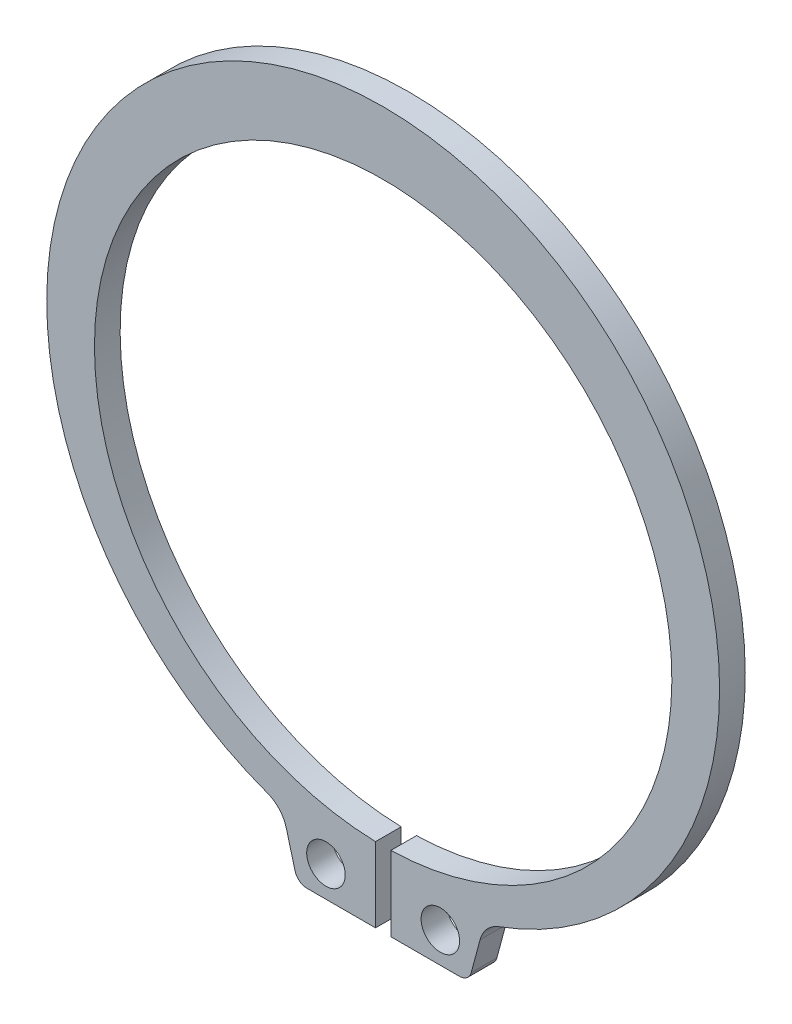
ISO-10303-21;
HEADER;
FILE_DESCRIPTION(('STEP AP214'),'2;1');
FILE_NAME('part.step','',(''),(''),'','','');
FILE_SCHEMA(('AUTOMOTIVE_DESIGN { 1 0 10303 214 1 1 1 1 }'));
ENDSEC;
DATA;
#1=APPLICATION_CONTEXT('core data for automotive mechanical design processes');
#2=APPLICATION_PROTOCOL_DEFINITION('international standard','automotive_design',2000,#1);
#3=PRODUCT_CONTEXT('',#1,'mechanical');
#4=PRODUCT('Part','Part','',(#3));
#5=PRODUCT_RELATED_PRODUCT_CATEGORY('part','',(#4));
#6=PRODUCT_DEFINITION_FORMATION('','',#4);
#7=PRODUCT_DEFINITION_CONTEXT('part definition',#1,'design');
#8=PRODUCT_DEFINITION('design','',#6,#7);
#9=PRODUCT_DEFINITION_SHAPE('','',#8);
#10=(LENGTH_UNIT() NAMED_UNIT(*) SI_UNIT(.MILLI.,.METRE.));
#11=(NAMED_UNIT(*) PLANE_ANGLE_UNIT() SI_UNIT($,.RADIAN.));
#12=(NAMED_UNIT(*) SI_UNIT($,.STERADIAN.) SOLID_ANGLE_UNIT());
#13=UNCERTAINTY_MEASURE_WITH_UNIT(LENGTH_MEASURE(1.E-05),#10,'distance_accuracy_value','');
#14=(GEOMETRIC_REPRESENTATION_CONTEXT(3) GLOBAL_UNCERTAINTY_ASSIGNED_CONTEXT((#13)) GLOBAL_UNIT_ASSIGNED_CONTEXT((#10,
#11,#12)) REPRESENTATION_CONTEXT('',''));
#15=CARTESIAN_POINT('',(0.,0.,0.));
#16=DIRECTION('',(0.,0.,1.));
#17=DIRECTION('',(1.,0.,0.));
#18=AXIS2_PLACEMENT_3D('',#15,#16,#17);
#19=CARTESIAN_POINT('',(0.,-15.7226,1.0668));
#20=DIRECTION('',(0.,1.,0.));
#21=DIRECTION('',(-1.,0.,0.));
#22=AXIS2_PLACEMENT_3D('',#19,#20,#21);
#23=PLANE('',#22);
#24=DIRECTION('',(1.,0.,0.));
#25=VECTOR('',#24,1.);
#26=CARTESIAN_POINT('',(0.,-15.7226,0.));
#27=LINE('',#26,#25);
#28=CARTESIAN_POINT('',(-3.16619789010669,-15.7226,0.));
#29=VERTEX_POINT('',#28);
#30=CARTESIAN_POINT('',(-0.3175,-15.7226,0.));
#31=VERTEX_POINT('',#30);
#32=EDGE_CURVE('E182',#29,#31,#27,.T.);
#33=ORIENTED_EDGE('',*,*,#32,.T.);
#34=DIRECTION('',(0.,0.,1.));
#35=VECTOR('',#34,1.);
#36=CARTESIAN_POINT('',(-0.3175,-15.7226,1.0668));
#37=LINE('',#36,#35);
#38=CARTESIAN_POINT('',(-0.3175,-15.7226,1.0668));
#39=VERTEX_POINT('',#38);
#40=EDGE_CURVE('E61',#31,#39,#37,.T.);
#41=ORIENTED_EDGE('',*,*,#40,.T.);
#42=DIRECTION('',(1.,0.,0.));
#43=VECTOR('',#42,1.);
#44=CARTESIAN_POINT('',(0.,-15.7226,1.0668));
#45=LINE('',#44,#43);
#46=CARTESIAN_POINT('',(-3.16619789010669,-15.7226,1.0668));
#47=VERTEX_POINT('',#46);
#48=EDGE_CURVE('E147',#47,#39,#45,.T.);
#49=ORIENTED_EDGE('',*,*,#48,.F.);
#50=DIRECTION('',(0.,0.,-1.));
#51=VECTOR('',#50,1.);
#52=CARTESIAN_POINT('',(-3.16619789010669,-15.7226,1.0668));
#53=LINE('',#52,#51);
#54=EDGE_CURVE('E181',#47,#29,#53,.T.);
#55=ORIENTED_EDGE('',*,*,#54,.T.);
#56=EDGE_LOOP('',(#33,#41,#49,#55));
#57=FACE_BOUND('',#56,.T.);
#58=ADVANCED_FACE('F38',(#57),#23,.F.);
#59=CARTESIAN_POINT('',(0.3175,-15.7226,1.0668));
#60=VERTEX_POINT('',#59);
#61=CARTESIAN_POINT('',(3.16619789010669,-15.7226,1.0668));
#62=VERTEX_POINT('',#61);
#63=EDGE_CURVE('E138',#60,#62,#45,.T.);
#64=ORIENTED_EDGE('',*,*,#63,.F.);
#65=DIRECTION('',(0.,0.,-1.));
#66=VECTOR('',#65,1.);
#67=CARTESIAN_POINT('',(0.3175,-15.7226,1.0668));
#68=LINE('',#67,#66);
#69=CARTESIAN_POINT('',(0.3175,-15.7226,0.));
#70=VERTEX_POINT('',#69);
#71=EDGE_CURVE('E124',#60,#70,#68,.T.);
#72=ORIENTED_EDGE('',*,*,#71,.T.);
#73=CARTESIAN_POINT('',(3.16619789010669,-15.7226,0.));
#74=VERTEX_POINT('',#73);
#75=EDGE_CURVE('E186',#70,#74,#27,.T.);
#76=ORIENTED_EDGE('',*,*,#75,.T.);
#77=DIRECTION('',(0.,0.,-1.));
#78=VECTOR('',#77,1.);
#79=CARTESIAN_POINT('',(3.16619789010669,-15.7226,1.0668));
#80=LINE('',#79,#78);
#81=EDGE_CURVE('E146',#62,#74,#80,.T.);
#82=ORIENTED_EDGE('',*,*,#81,.F.);
#83=EDGE_LOOP('',(#64,#72,#76,#82));
#84=FACE_BOUND('',#83,.T.);
#85=ADVANCED_FACE('F40',(#84),#23,.F.);
#86=CARTESIAN_POINT('',(3.16619789010669,-15.2146,1.0668));
#87=DIRECTION('',(0.,0.,-1.));
#88=DIRECTION('',(-1.,0.,0.));
#89=AXIS2_PLACEMENT_3D('',#86,#87,#88);
#90=CYLINDRICAL_SURFACE('',#89,0.508);
#91=CARTESIAN_POINT('',(3.16619789010669,-15.2146,0.));
#92=DIRECTION('',(0.,0.,1.));
#93=DIRECTION('',(1.,0.,0.));
#94=AXIS2_PLACEMENT_3D('',#91,#92,#93);
#95=CIRCLE('',#94,0.508);
#96=CARTESIAN_POINT('',(3.65688820986153,-15.3460800749121,0.));
#97=VERTEX_POINT('',#96);
#98=EDGE_CURVE('E185',#74,#97,#95,.T.);
#99=ORIENTED_EDGE('',*,*,#98,.T.);
#100=DIRECTION('',(0.,0.,-1.));
#101=VECTOR('',#100,1.);
#102=CARTESIAN_POINT('',(3.65688820986153,-15.3460800749121,1.0668));
#103=LINE('',#102,#101);
#104=CARTESIAN_POINT('',(3.65688820986153,-15.3460800749121,1.0668));
#105=VERTEX_POINT('',#104);
#106=EDGE_CURVE('E222',#105,#97,#103,.T.);
#107=ORIENTED_EDGE('',*,*,#106,.F.);
#108=CARTESIAN_POINT('',(3.16619789010669,-15.2146,1.0668));
#109=DIRECTION('',(0.,0.,1.));
#110=DIRECTION('',(1.,0.,0.));
#111=AXIS2_PLACEMENT_3D('',#108,#109,#110);
#112=CIRCLE('',#111,0.508);
#113=EDGE_CURVE('E151',#62,#105,#112,.T.);
#114=ORIENTED_EDGE('',*,*,#113,.F.);
#115=ORIENTED_EDGE('',*,*,#81,.T.);
#116=EDGE_LOOP('',(#99,#107,#114,#115));
#117=FACE_BOUND('',#116,.T.);
#118=ADVANCED_FACE('F268',(#117),#90,.T.);
#119=CARTESIAN_POINT('',(7.24844316792874,-1.9422144932294,1.0668));
#120=DIRECTION('',(-0.965925826289068,0.258819045102521,0.));
#121=DIRECTION('',(-0.258819045102521,-0.965925826289068,0.));
#122=AXIS2_PLACEMENT_3D('',#119,#120,#121);
#123=PLANE('',#122);
#124=DIRECTION('',(0.258819045102521,0.965925826289068,0.));
#125=VECTOR('',#124,1.);
#126=CARTESIAN_POINT('',(7.24844316792874,-1.9422144932294,0.));
#127=LINE('',#126,#125);
#128=CARTESIAN_POINT('',(4.02334540152789,-13.9784432168142,0.));
#129=VERTEX_POINT('',#128);
#130=EDGE_CURVE('E188',#97,#129,#127,.T.);
#131=ORIENTED_EDGE('',*,*,#130,.T.);
#132=DIRECTION('',(0.,0.,-1.));
#133=VECTOR('',#132,1.);
#134=CARTESIAN_POINT('',(4.02334540152789,-13.9784432168142,1.0668));
#135=LINE('',#134,#133);
#136=CARTESIAN_POINT('',(4.02334540152789,-13.9784432168142,1.0668));
#137=VERTEX_POINT('',#136);
#138=EDGE_CURVE('E219',#137,#129,#135,.T.);
#139=ORIENTED_EDGE('',*,*,#138,.F.);
#140=DIRECTION('',(0.258819045102521,0.965925826289068,0.));
#141=VECTOR('',#140,1.);
#142=CARTESIAN_POINT('',(7.24844316792874,-1.9422144932294,1.0668));
#143=LINE('',#142,#141);
#144=EDGE_CURVE('E159',#105,#137,#143,.T.);
#145=ORIENTED_EDGE('',*,*,#144,.F.);
#146=ORIENTED_EDGE('',*,*,#106,.T.);
#147=EDGE_LOOP('',(#131,#139,#145,#146));
#148=FACE_BOUND('',#147,.T.);
#149=ADVANCED_FACE('F265',(#148),#123,.F.);
#150=CARTESIAN_POINT('',(5.25007120091501,-14.3071434040944,1.0668));
#151=DIRECTION('',(0.,0.,-1.));
#152=DIRECTION('',(-1.,0.,0.));
#153=AXIS2_PLACEMENT_3D('',#150,#151,#152);
#154=CYLINDRICAL_SURFACE('',#153,1.27);
#155=CARTESIAN_POINT('',(5.25007120091501,-14.3071434040944,0.));
#156=DIRECTION('',(0.,0.,1.));
#157=DIRECTION('',(1.,0.,0.));
#158=AXIS2_PLACEMENT_3D('',#155,#156,#157);
#159=CIRCLE('',#158,1.27);
#160=CARTESIAN_POINT('',(4.81256526750542,-13.1148814537532,0.));
#161=VERTEX_POINT('',#160);
#162=EDGE_CURVE('E190',#129,#161,#159,.F.);
#163=ORIENTED_EDGE('',*,*,#162,.T.);
#164=DIRECTION('',(0.,0.,-1.));
#165=VECTOR('',#164,1.);
#166=CARTESIAN_POINT('',(4.81256526750542,-13.1148814537532,1.0668));
#167=LINE('',#166,#165);
#168=CARTESIAN_POINT('',(4.81256526750542,-13.1148814537532,1.0668));
#169=VERTEX_POINT('',#168);
#170=EDGE_CURVE('E216',#169,#161,#167,.T.);
#171=ORIENTED_EDGE('',*,*,#170,.F.);
#172=CARTESIAN_POINT('',(5.25007120091501,-14.3071434040944,1.0668));
#173=DIRECTION('',(0.,0.,1.));
#174=DIRECTION('',(1.,0.,0.));
#175=AXIS2_PLACEMENT_3D('',#172,#173,#174);
#176=CIRCLE('',#175,1.27);
#177=EDGE_CURVE('E161',#137,#169,#176,.F.);
#178=ORIENTED_EDGE('',*,*,#177,.F.);
#179=ORIENTED_EDGE('',*,*,#138,.T.);
#180=EDGE_LOOP('',(#163,#171,#178,#179));
#181=FACE_BOUND('',#180,.T.);
#182=ADVANCED_FACE('F260',(#181),#154,.F.);
#183=CARTESIAN_POINT('',(0.,0.,1.0668));
#184=DIRECTION('',(0.,0.,-1.));
#185=DIRECTION('',(-1.,0.,0.));
#186=AXIS2_PLACEMENT_3D('',#183,#184,#185);
#187=CYLINDRICAL_SURFACE('',#186,13.97);
#188=CARTESIAN_POINT('',(0.,0.,0.));
#189=DIRECTION('',(0.,0.,1.));
#190=DIRECTION('',(1.,0.,0.));
#191=AXIS2_PLACEMENT_3D('',#188,#189,#190);
#192=CIRCLE('',#191,13.97);
#193=CARTESIAN_POINT('',(-4.81256526750543,-13.1148814537532,0.));
#194=VERTEX_POINT('',#193);
#195=EDGE_CURVE('E192',#161,#194,#192,.T.);
#196=ORIENTED_EDGE('',*,*,#195,.T.);
#197=DIRECTION('',(0.,0.,-1.));
#198=VECTOR('',#197,1.);
#199=CARTESIAN_POINT('',(-4.81256526750543,-13.1148814537532,1.0668));
#200=LINE('',#199,#198);
#201=CARTESIAN_POINT('',(-4.81256526750543,-13.1148814537532,1.0668));
#202=VERTEX_POINT('',#201);
#203=EDGE_CURVE('E214',#202,#194,#200,.T.);
#204=ORIENTED_EDGE('',*,*,#203,.F.);
#205=CARTESIAN_POINT('',(0.,0.,1.0668));
#206=DIRECTION('',(0.,0.,1.));
#207=DIRECTION('',(1.,0.,0.));
#208=AXIS2_PLACEMENT_3D('',#205,#206,#207);
#209=CIRCLE('',#208,13.97);
#210=EDGE_CURVE('E163',#169,#202,#209,.T.);
#211=ORIENTED_EDGE('',*,*,#210,.F.);
#212=ORIENTED_EDGE('',*,*,#170,.T.);
#213=EDGE_LOOP('',(#196,#204,#211,#212));
#214=FACE_BOUND('',#213,.T.);
#215=ADVANCED_FACE('F255',(#214),#187,.T.);
#216=CARTESIAN_POINT('',(-5.25007120091501,-14.3071434040944,1.0668));
#217=DIRECTION('',(0.,0.,-1.));
#218=DIRECTION('',(-1.,0.,0.));
#219=AXIS2_PLACEMENT_3D('',#216,#217,#218);
#220=CYLINDRICAL_SURFACE('',#219,1.27);
#221=CARTESIAN_POINT('',(-5.25007120091501,-14.3071434040944,0.));
#222=DIRECTION('',(0.,0.,1.));
#223=DIRECTION('',(1.,0.,0.));
#224=AXIS2_PLACEMENT_3D('',#221,#222,#223);
#225=CIRCLE('',#224,1.27);
#226=CARTESIAN_POINT('',(-4.02334540152789,-13.9784432168142,0.));
#227=VERTEX_POINT('',#226);
#228=EDGE_CURVE('E195',#227,#194,#225,.T.);
#229=ORIENTED_EDGE('',*,*,#228,.F.);
#230=DIRECTION('',(0.,0.,-1.));
#231=VECTOR('',#230,1.);
#232=CARTESIAN_POINT('',(-4.02334540152789,-13.9784432168142,1.0668));
#233=LINE('',#232,#231);
#234=CARTESIAN_POINT('',(-4.02334540152789,-13.9784432168142,1.0668));
#235=VERTEX_POINT('',#234);
#236=EDGE_CURVE('E212',#235,#227,#233,.T.);
#237=ORIENTED_EDGE('',*,*,#236,.F.);
#238=CARTESIAN_POINT('',(-5.25007120091501,-14.3071434040944,1.0668));
#239=DIRECTION('',(0.,0.,1.));
#240=DIRECTION('',(1.,0.,0.));
#241=AXIS2_PLACEMENT_3D('',#238,#239,#240);
#242=CIRCLE('',#241,1.27);
#243=EDGE_CURVE('E165',#235,#202,#242,.T.);
#244=ORIENTED_EDGE('',*,*,#243,.T.);
#245=ORIENTED_EDGE('',*,*,#203,.T.);
#246=EDGE_LOOP('',(#229,#237,#244,#245));
#247=FACE_BOUND('',#246,.T.);
#248=ADVANCED_FACE('F251',(#247),#220,.F.);
#249=CARTESIAN_POINT('',(-7.24844316792874,-1.9422144932294,1.0668));
#250=DIRECTION('',(-0.965925826289068,-0.258819045102521,0.));
#251=DIRECTION('',(0.258819045102521,-0.965925826289068,0.));
#252=AXIS2_PLACEMENT_3D('',#249,#250,#251);
#253=PLANE('',#252);
#254=DIRECTION('',(-0.258819045102521,0.965925826289068,0.));
#255=VECTOR('',#254,1.);
#256=CARTESIAN_POINT('',(-7.24844316792874,-1.9422144932294,0.));
#257=LINE('',#256,#255);
#258=CARTESIAN_POINT('',(-3.65688820986153,-15.3460800749121,0.));
#259=VERTEX_POINT('',#258);
#260=EDGE_CURVE('E198',#259,#227,#257,.T.);
#261=ORIENTED_EDGE('',*,*,#260,.F.);
#262=DIRECTION('',(0.,0.,-1.));
#263=VECTOR('',#262,1.);
#264=CARTESIAN_POINT('',(-3.65688820986153,-15.3460800749121,1.0668));
#265=LINE('',#264,#263);
#266=CARTESIAN_POINT('',(-3.65688820986153,-15.3460800749121,1.0668));
#267=VERTEX_POINT('',#266);
#268=EDGE_CURVE('E210',#267,#259,#265,.T.);
#269=ORIENTED_EDGE('',*,*,#268,.F.);
#270=DIRECTION('',(-0.258819045102521,0.965925826289068,0.));
#271=VECTOR('',#270,1.);
#272=CARTESIAN_POINT('',(-7.24844316792874,-1.9422144932294,1.0668));
#273=LINE('',#272,#271);
#274=EDGE_CURVE('E168',#267,#235,#273,.T.);
#275=ORIENTED_EDGE('',*,*,#274,.T.);
#276=ORIENTED_EDGE('',*,*,#236,.T.);
#277=EDGE_LOOP('',(#261,#269,#275,#276));
#278=FACE_BOUND('',#277,.T.);
#279=ADVANCED_FACE('F249',(#278),#253,.T.);
#280=CARTESIAN_POINT('',(2.3749,-14.4526,1.0668));
#281=DIRECTION('',(0.,0.,-1.));
#282=DIRECTION('',(-1.,0.,0.));
#283=AXIS2_PLACEMENT_3D('',#280,#281,#282);
#284=CYLINDRICAL_SURFACE('',#283,0.800099999999999);
#285=CARTESIAN_POINT('',(2.3749,-14.4526,1.0668));
#286=DIRECTION('',(0.,0.,1.));
#287=DIRECTION('',(1.,0.,0.));
#288=AXIS2_PLACEMENT_3D('',#285,#286,#287);
#289=CIRCLE('',#288,0.800099999999999);
#290=CARTESIAN_POINT('',(3.175,-14.4526,1.0668));
#291=VERTEX_POINT('',#290);
#292=EDGE_CURVE('E175',#291,#291,#289,.T.);
#293=ORIENTED_EDGE('',*,*,#292,.T.);
#294=EDGE_LOOP('',(#293));
#295=FACE_BOUND('',#294,.T.);
#296=CARTESIAN_POINT('',(2.3749,-14.4526,0.));
#297=DIRECTION('',(0.,0.,1.));
#298=DIRECTION('',(1.,0.,0.));
#299=AXIS2_PLACEMENT_3D('',#296,#297,#298);
#300=CIRCLE('',#299,0.800099999999999);
#301=CARTESIAN_POINT('',(3.175,-14.4526,0.));
#302=VERTEX_POINT('',#301);
#303=EDGE_CURVE('E153',#302,#302,#300,.T.);
#304=ORIENTED_EDGE('',*,*,#303,.F.);
#305=EDGE_LOOP('',(#304));
#306=FACE_BOUND('',#305,.T.);
#307=ADVANCED_FACE('F293',(#295,#306),#284,.F.);
#308=CARTESIAN_POINT('',(0.,-0.635,1.0668));
#309=DIRECTION('',(0.,0.,-1.));
#310=DIRECTION('',(-1.,0.,0.));
#311=AXIS2_PLACEMENT_3D('',#308,#309,#310);
#312=CYLINDRICAL_SURFACE('',#311,11.9888);
#313=DIRECTION('',(0.,0.,-1.));
#314=VECTOR('',#313,1.);
#315=CARTESIAN_POINT('',(-0.3175,-12.6195950782661,1.0668));
#316=LINE('',#315,#314);
#317=CARTESIAN_POINT('',(-0.3175,-12.6195950782661,0.));
#318=VERTEX_POINT('',#317);
#319=CARTESIAN_POINT('',(-0.3175,-12.6195950782661,1.0668));
#320=VERTEX_POINT('',#319);
#321=EDGE_CURVE('E131',#318,#320,#316,.F.);
#322=ORIENTED_EDGE('',*,*,#321,.F.);
#323=CARTESIAN_POINT('',(0.,-0.635,0.));
#324=DIRECTION('',(0.,0.,1.));
#325=DIRECTION('',(1.,0.,0.));
#326=AXIS2_PLACEMENT_3D('',#323,#324,#325);
#327=CIRCLE('',#326,11.9888);
#328=CARTESIAN_POINT('',(0.3175,-12.6195950782661,0.));
#329=VERTEX_POINT('',#328);
#330=EDGE_CURVE('E204',#329,#318,#327,.T.);
#331=ORIENTED_EDGE('',*,*,#330,.F.);
#332=DIRECTION('',(0.,0.,-1.));
#333=VECTOR('',#332,1.);
#334=CARTESIAN_POINT('',(0.3175,-12.6195950782661,1.0668));
#335=LINE('',#334,#333);
#336=CARTESIAN_POINT('',(0.3175,-12.6195950782661,1.0668));
#337=VERTEX_POINT('',#336);
#338=EDGE_CURVE('E53',#337,#329,#335,.T.);
#339=ORIENTED_EDGE('',*,*,#338,.F.);
#340=CARTESIAN_POINT('',(0.,-0.635,1.0668));
#341=DIRECTION('',(0.,0.,1.));
#342=DIRECTION('',(1.,0.,0.));
#343=AXIS2_PLACEMENT_3D('',#340,#341,#342);
#344=CIRCLE('',#343,11.9888);
#345=EDGE_CURVE('E141',#337,#320,#344,.T.);
#346=ORIENTED_EDGE('',*,*,#345,.T.);
#347=EDGE_LOOP('',(#322,#331,#339,#346));
#348=FACE_BOUND('',#347,.T.);
#349=ADVANCED_FACE('F232',(#348),#312,.F.);
#350=CARTESIAN_POINT('',(-3.16619789010669,-15.2146,1.0668));
#351=DIRECTION('',(0.,0.,-1.));
#352=DIRECTION('',(-1.,0.,0.));
#353=AXIS2_PLACEMENT_3D('',#350,#351,#352);
#354=CYLINDRICAL_SURFACE('',#353,0.508);
#355=CARTESIAN_POINT('',(-3.16619789010669,-15.2146,0.));
#356=DIRECTION('',(0.,0.,1.));
#357=DIRECTION('',(1.,0.,0.));
#358=AXIS2_PLACEMENT_3D('',#355,#356,#357);
#359=CIRCLE('',#358,0.508);
#360=EDGE_CURVE('E201',#29,#259,#359,.F.);
#361=ORIENTED_EDGE('',*,*,#360,.F.);
#362=ORIENTED_EDGE('',*,*,#54,.F.);
#363=CARTESIAN_POINT('',(-3.16619789010669,-15.2146,1.0668));
#364=DIRECTION('',(0.,0.,1.));
#365=DIRECTION('',(1.,0.,0.));
#366=AXIS2_PLACEMENT_3D('',#363,#364,#365);
#367=CIRCLE('',#366,0.508);
#368=EDGE_CURVE('E171',#47,#267,#367,.F.);
#369=ORIENTED_EDGE('',*,*,#368,.T.);
#370=ORIENTED_EDGE('',*,*,#268,.T.);
#371=EDGE_LOOP('',(#361,#362,#369,#370));
#372=FACE_BOUND('',#371,.T.);
#373=ADVANCED_FACE('F244',(#372),#354,.T.);
#374=CARTESIAN_POINT('',(-2.3749,-14.4526,1.0668));
#375=DIRECTION('',(0.,0.,-1.));
#376=DIRECTION('',(-1.,0.,0.));
#377=AXIS2_PLACEMENT_3D('',#374,#375,#376);
#378=CYLINDRICAL_SURFACE('',#377,0.800099999999999);
#379=CARTESIAN_POINT('',(-2.3749,-14.4526,1.0668));
#380=DIRECTION('',(0.,0.,1.));
#381=DIRECTION('',(1.,0.,0.));
#382=AXIS2_PLACEMENT_3D('',#379,#380,#381);
#383=CIRCLE('',#382,0.800099999999999);
#384=CARTESIAN_POINT('',(-1.5748,-14.4526,1.0668));
#385=VERTEX_POINT('',#384);
#386=EDGE_CURVE('E178',#385,#385,#383,.F.);
#387=ORIENTED_EDGE('',*,*,#386,.F.);
#388=EDGE_LOOP('',(#387));
#389=FACE_BOUND('',#388,.T.);
#390=CARTESIAN_POINT('',(-2.3749,-14.4526,0.));
#391=DIRECTION('',(0.,0.,1.));
#392=DIRECTION('',(1.,0.,0.));
#393=AXIS2_PLACEMENT_3D('',#390,#391,#392);
#394=CIRCLE('',#393,0.800099999999999);
#395=CARTESIAN_POINT('',(-1.5748,-14.4526,0.));
#396=VERTEX_POINT('',#395);
#397=EDGE_CURVE('E148',#396,#396,#394,.F.);
#398=ORIENTED_EDGE('',*,*,#397,.T.);
#399=EDGE_LOOP('',(#398));
#400=FACE_BOUND('',#399,.T.);
#401=ADVANCED_FACE('F306',(#389,#400),#378,.F.);
#402=CARTESIAN_POINT('',(0.,0.,1.0668));
#403=DIRECTION('',(0.,0.,1.));
#404=DIRECTION('',(1.,0.,0.));
#405=AXIS2_PLACEMENT_3D('',#402,#403,#404);
#406=PLANE('',#405);
#407=DIRECTION('',(0.,-1.,0.));
#408=VECTOR('',#407,1.);
#409=CARTESIAN_POINT('',(-0.3175,-16.3529533963897,1.0668));
#410=LINE('',#409,#408);
#411=EDGE_CURVE('E142',#320,#39,#410,.T.);
#412=ORIENTED_EDGE('',*,*,#411,.F.);
#413=ORIENTED_EDGE('',*,*,#345,.F.);
#414=DIRECTION('',(0.,1.,0.));
#415=VECTOR('',#414,1.);
#416=CARTESIAN_POINT('',(0.3175,-16.3529533963897,1.0668));
#417=LINE('',#416,#415);
#418=EDGE_CURVE('E127',#60,#337,#417,.T.);
#419=ORIENTED_EDGE('',*,*,#418,.F.);
#420=ORIENTED_EDGE('',*,*,#63,.T.);
#421=ORIENTED_EDGE('',*,*,#113,.T.);
#422=ORIENTED_EDGE('',*,*,#144,.T.);
#423=ORIENTED_EDGE('',*,*,#177,.T.);
#424=ORIENTED_EDGE('',*,*,#210,.T.);
#425=ORIENTED_EDGE('',*,*,#243,.F.);
#426=ORIENTED_EDGE('',*,*,#274,.F.);
#427=ORIENTED_EDGE('',*,*,#368,.F.);
#428=ORIENTED_EDGE('',*,*,#48,.T.);
#429=EDGE_LOOP('',(#412,#413,#419,#420,#421,#422,#423,#424,#425,#426,#427,#428));
#430=FACE_BOUND('',#429,.T.);
#431=ORIENTED_EDGE('',*,*,#292,.F.);
#432=EDGE_LOOP('',(#431));
#433=FACE_BOUND('',#432,.T.);
#434=ORIENTED_EDGE('',*,*,#386,.T.);
#435=EDGE_LOOP('',(#434));
#436=FACE_BOUND('',#435,.T.);
#437=ADVANCED_FACE('F136',(#430,#433,#436),#406,.T.);
#438=CARTESIAN_POINT('',(0.,0.,0.));
#439=DIRECTION('',(0.,0.,1.));
#440=DIRECTION('',(1.,0.,0.));
#441=AXIS2_PLACEMENT_3D('',#438,#439,#440);
#442=PLANE('',#441);
#443=ORIENTED_EDGE('',*,*,#330,.T.);
#444=DIRECTION('',(0.,-1.,0.));
#445=VECTOR('',#444,1.);
#446=CARTESIAN_POINT('',(-0.3175,0.,0.));
#447=LINE('',#446,#445);
#448=EDGE_CURVE('E11',#318,#31,#447,.T.);
#449=ORIENTED_EDGE('',*,*,#448,.T.);
#450=ORIENTED_EDGE('',*,*,#32,.F.);
#451=ORIENTED_EDGE('',*,*,#360,.T.);
#452=ORIENTED_EDGE('',*,*,#260,.T.);
#453=ORIENTED_EDGE('',*,*,#228,.T.);
#454=ORIENTED_EDGE('',*,*,#195,.F.);
#455=ORIENTED_EDGE('',*,*,#162,.F.);
#456=ORIENTED_EDGE('',*,*,#130,.F.);
#457=ORIENTED_EDGE('',*,*,#98,.F.);
#458=ORIENTED_EDGE('',*,*,#75,.F.);
#459=DIRECTION('',(0.,1.,0.));
#460=VECTOR('',#459,1.);
#461=CARTESIAN_POINT('',(0.3175,0.,0.));
#462=LINE('',#461,#460);
#463=EDGE_CURVE('E46',#70,#329,#462,.T.);
#464=ORIENTED_EDGE('',*,*,#463,.T.);
#465=EDGE_LOOP('',(#443,#449,#450,#451,#452,#453,#454,#455,#456,#457,#458,#464));
#466=FACE_BOUND('',#465,.T.);
#467=ORIENTED_EDGE('',*,*,#303,.T.);
#468=EDGE_LOOP('',(#467));
#469=FACE_BOUND('',#468,.T.);
#470=ORIENTED_EDGE('',*,*,#397,.F.);
#471=EDGE_LOOP('',(#470));
#472=FACE_BOUND('',#471,.T.);
#473=ADVANCED_FACE('F227',(#466,#469,#472),#442,.F.);
#474=CARTESIAN_POINT('',(0.3175,-16.3529533963897,0.));
#475=DIRECTION('',(1.,0.,0.));
#476=DIRECTION('',(0.,0.,-1.));
#477=AXIS2_PLACEMENT_3D('',#474,#475,#476);
#478=PLANE('',#477);
#479=ORIENTED_EDGE('',*,*,#418,.T.);
#480=ORIENTED_EDGE('',*,*,#338,.T.);
#481=ORIENTED_EDGE('',*,*,#463,.F.);
#482=ORIENTED_EDGE('',*,*,#71,.F.);
#483=EDGE_LOOP('',(#479,#480,#481,#482));
#484=FACE_BOUND('',#483,.T.);
#485=ADVANCED_FACE('F126',(#484),#478,.F.);
#486=CARTESIAN_POINT('',(-0.3175,-16.3529533963897,0.));
#487=DIRECTION('',(-1.,0.,0.));
#488=DIRECTION('',(0.,0.,1.));
#489=AXIS2_PLACEMENT_3D('',#486,#487,#488);
#490=PLANE('',#489);
#491=ORIENTED_EDGE('',*,*,#448,.F.);
#492=ORIENTED_EDGE('',*,*,#321,.T.);
#493=ORIENTED_EDGE('',*,*,#411,.T.);
#494=ORIENTED_EDGE('',*,*,#40,.F.);
#495=EDGE_LOOP('',(#491,#492,#493,#494));
#496=FACE_BOUND('',#495,.T.);
#497=ADVANCED_FACE('F235',(#496),#490,.F.);
#498=CLOSED_SHELL('',(#58,#85,#118,#149,#182,#215,#248,#279,#307,#349,#373,#401,#437,#473,#485,#497));
#499=MANIFOLD_SOLID_BREP('B2',#498);
#500=ADVANCED_BREP_SHAPE_REPRESENTATION('',(#18,#499),#14);
#501=SHAPE_DEFINITION_REPRESENTATION(#9,#500);
ENDSEC;
END-ISO-10303-21;
